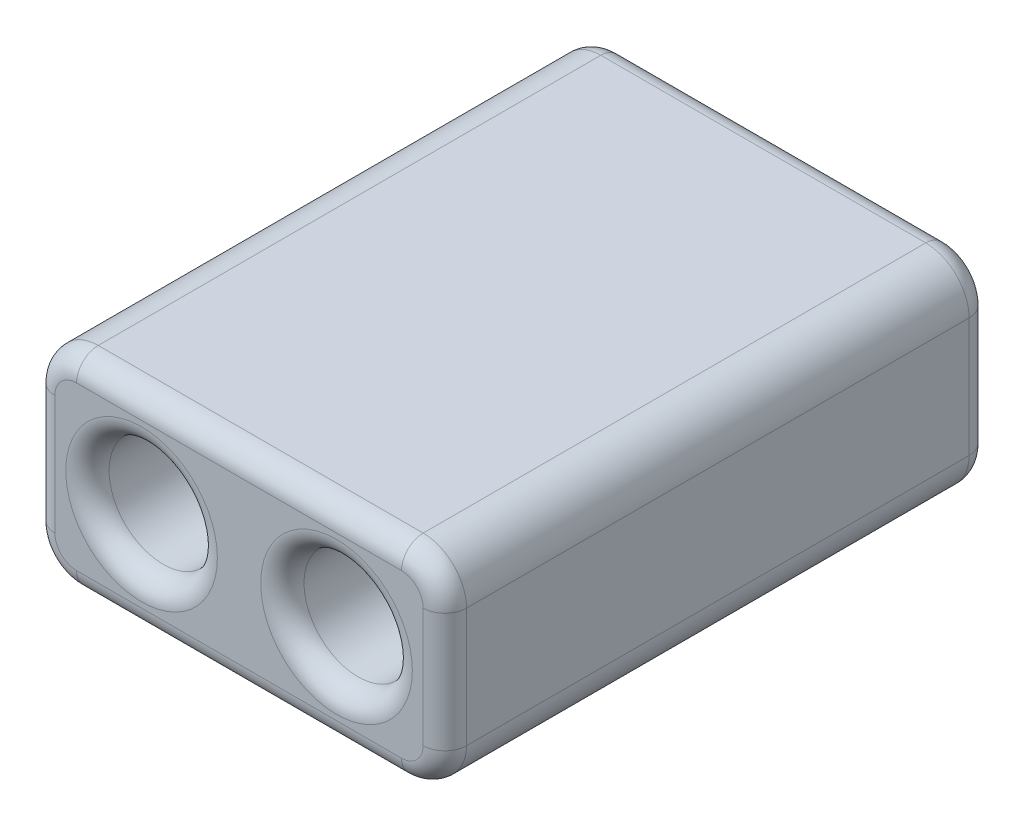
ISO-10303-21;
HEADER;
FILE_DESCRIPTION(('STEP AP214'),'2;1');
FILE_NAME('part.step','',(''),(''),'','','');
FILE_SCHEMA(('AUTOMOTIVE_DESIGN { 1 0 10303 214 1 1 1 1 }'));
ENDSEC;
DATA;
#1=APPLICATION_CONTEXT('core data for automotive mechanical design processes');
#2=APPLICATION_PROTOCOL_DEFINITION('international standard','automotive_design',2000,#1);
#3=PRODUCT_CONTEXT('',#1,'mechanical');
#4=PRODUCT('Part','Part','',(#3));
#5=PRODUCT_RELATED_PRODUCT_CATEGORY('part','',(#4));
#6=PRODUCT_DEFINITION_FORMATION('','',#4);
#7=PRODUCT_DEFINITION_CONTEXT('part definition',#1,'design');
#8=PRODUCT_DEFINITION('design','',#6,#7);
#9=PRODUCT_DEFINITION_SHAPE('','',#8);
#10=(LENGTH_UNIT() NAMED_UNIT(*) SI_UNIT(.MILLI.,.METRE.));
#11=(NAMED_UNIT(*) PLANE_ANGLE_UNIT() SI_UNIT($,.RADIAN.));
#12=(NAMED_UNIT(*) SI_UNIT($,.STERADIAN.) SOLID_ANGLE_UNIT());
#13=UNCERTAINTY_MEASURE_WITH_UNIT(LENGTH_MEASURE(1.E-05),#10,'distance_accuracy_value','');
#14=(GEOMETRIC_REPRESENTATION_CONTEXT(3) GLOBAL_UNCERTAINTY_ASSIGNED_CONTEXT((#13)) GLOBAL_UNIT_ASSIGNED_CONTEXT((#10,
#11,#12)) REPRESENTATION_CONTEXT('',''));
#15=CARTESIAN_POINT('',(0.,0.,0.));
#16=DIRECTION('',(0.,0.,1.));
#17=DIRECTION('',(1.,0.,0.));
#18=AXIS2_PLACEMENT_3D('',#15,#16,#17);
#19=CARTESIAN_POINT('',(0.,0.,25.2));
#20=DIRECTION('',(0.,0.,1.));
#21=DIRECTION('',(1.,0.,0.));
#22=AXIS2_PLACEMENT_3D('',#19,#20,#21);
#23=PLANE('',#22);
#24=CARTESIAN_POINT('',(4.5,0.,25.2));
#25=DIRECTION('',(0.,0.,1.));
#26=DIRECTION('',(1.,0.,0.));
#27=AXIS2_PLACEMENT_3D('',#24,#25,#26);
#28=CIRCLE('',#27,3.5);
#29=CARTESIAN_POINT('',(8.,0.,25.2));
#30=VERTEX_POINT('',#29);
#31=EDGE_CURVE('E179',#30,#30,#28,.F.);
#32=ORIENTED_EDGE('',*,*,#31,.T.);
#33=EDGE_LOOP('',(#32));
#34=FACE_BOUND('',#33,.T.);
#35=DIRECTION('',(0.,-1.,0.));
#36=VECTOR('',#35,1.);
#37=CARTESIAN_POINT('',(-8.5,-2.75,25.2));
#38=LINE('',#37,#36);
#39=CARTESIAN_POINT('',(-8.5,2.75,25.2));
#40=VERTEX_POINT('',#39);
#41=CARTESIAN_POINT('',(-8.5,-2.75,25.2));
#42=VERTEX_POINT('',#41);
#43=EDGE_CURVE('E177',#40,#42,#38,.T.);
#44=ORIENTED_EDGE('',*,*,#43,.T.);
#45=CARTESIAN_POINT('',(-7.5,-2.75,25.2));
#46=DIRECTION('',(0.,0.,1.));
#47=DIRECTION('',(1.,0.,0.));
#48=AXIS2_PLACEMENT_3D('',#45,#46,#47);
#49=CIRCLE('',#48,1.);
#50=CARTESIAN_POINT('',(-7.5,-3.75,25.2));
#51=VERTEX_POINT('',#50);
#52=EDGE_CURVE('E158',#42,#51,#49,.T.);
#53=ORIENTED_EDGE('',*,*,#52,.T.);
#54=DIRECTION('',(1.,0.,0.));
#55=VECTOR('',#54,1.);
#56=CARTESIAN_POINT('',(7.5,-3.75,25.2));
#57=LINE('',#56,#55);
#58=CARTESIAN_POINT('',(7.5,-3.75,25.2));
#59=VERTEX_POINT('',#58);
#60=EDGE_CURVE('E166',#51,#59,#57,.T.);
#61=ORIENTED_EDGE('',*,*,#60,.T.);
#62=CARTESIAN_POINT('',(7.5,-2.75,25.2));
#63=DIRECTION('',(0.,0.,1.));
#64=DIRECTION('',(1.,0.,0.));
#65=AXIS2_PLACEMENT_3D('',#62,#63,#64);
#66=CIRCLE('',#65,1.);
#67=CARTESIAN_POINT('',(8.49999999999999,-2.75,25.2));
#68=VERTEX_POINT('',#67);
#69=EDGE_CURVE('E172',#59,#68,#66,.T.);
#70=ORIENTED_EDGE('',*,*,#69,.T.);
#71=DIRECTION('',(0.,1.,0.));
#72=VECTOR('',#71,1.);
#73=CARTESIAN_POINT('',(8.5,2.75,25.2));
#74=LINE('',#73,#72);
#75=CARTESIAN_POINT('',(8.5,2.75,25.2));
#76=VERTEX_POINT('',#75);
#77=EDGE_CURVE('E327',#68,#76,#74,.T.);
#78=ORIENTED_EDGE('',*,*,#77,.T.);
#79=CARTESIAN_POINT('',(7.5,2.75,25.2));
#80=DIRECTION('',(0.,0.,1.));
#81=DIRECTION('',(1.,0.,0.));
#82=AXIS2_PLACEMENT_3D('',#79,#80,#81);
#83=CIRCLE('',#82,1.);
#84=CARTESIAN_POINT('',(7.5,3.75,25.2));
#85=VERTEX_POINT('',#84);
#86=EDGE_CURVE('E329',#76,#85,#83,.T.);
#87=ORIENTED_EDGE('',*,*,#86,.T.);
#88=DIRECTION('',(-1.,0.,0.));
#89=VECTOR('',#88,1.);
#90=CARTESIAN_POINT('',(-7.5,3.75,25.2));
#91=LINE('',#90,#89);
#92=CARTESIAN_POINT('',(-7.5,3.75,25.2));
#93=VERTEX_POINT('',#92);
#94=EDGE_CURVE('E331',#85,#93,#91,.T.);
#95=ORIENTED_EDGE('',*,*,#94,.T.);
#96=CARTESIAN_POINT('',(-7.5,2.75,25.2));
#97=DIRECTION('',(0.,0.,1.));
#98=DIRECTION('',(1.,0.,0.));
#99=AXIS2_PLACEMENT_3D('',#96,#97,#98);
#100=CIRCLE('',#99,1.);
#101=EDGE_CURVE('E183',#93,#40,#100,.T.);
#102=ORIENTED_EDGE('',*,*,#101,.T.);
#103=EDGE_LOOP('',(#44,#53,#61,#70,#78,#87,#95,#102));
#104=FACE_BOUND('',#103,.T.);
#105=CARTESIAN_POINT('',(-4.5,0.,25.2));
#106=DIRECTION('',(0.,0.,1.));
#107=DIRECTION('',(1.,0.,0.));
#108=AXIS2_PLACEMENT_3D('',#105,#106,#107);
#109=CIRCLE('',#108,3.5);
#110=CARTESIAN_POINT('',(-1.,0.,25.2));
#111=VERTEX_POINT('',#110);
#112=EDGE_CURVE('E173',#111,#111,#109,.F.);
#113=ORIENTED_EDGE('',*,*,#112,.T.);
#114=EDGE_LOOP('',(#113));
#115=FACE_BOUND('',#114,.T.);
#116=ADVANCED_FACE('F37',(#34,#104,#115),#23,.T.);
#117=CARTESIAN_POINT('',(0.,0.,0.));
#118=DIRECTION('',(0.,0.,1.));
#119=DIRECTION('',(1.,0.,0.));
#120=AXIS2_PLACEMENT_3D('',#117,#118,#119);
#121=PLANE('',#120);
#122=CARTESIAN_POINT('',(4.5,0.,0.));
#123=DIRECTION('',(0.,0.,1.));
#124=DIRECTION('',(1.,0.,0.));
#125=AXIS2_PLACEMENT_3D('',#122,#123,#124);
#126=CIRCLE('',#125,3.5);
#127=CARTESIAN_POINT('',(8.,0.,0.));
#128=VERTEX_POINT('',#127);
#129=EDGE_CURVE('E246',#128,#128,#126,.T.);
#130=ORIENTED_EDGE('',*,*,#129,.T.);
#131=EDGE_LOOP('',(#130));
#132=FACE_BOUND('',#131,.T.);
#133=CARTESIAN_POINT('',(-4.5,0.,0.));
#134=DIRECTION('',(0.,0.,1.));
#135=DIRECTION('',(1.,0.,0.));
#136=AXIS2_PLACEMENT_3D('',#133,#134,#135);
#137=CIRCLE('',#136,3.5);
#138=CARTESIAN_POINT('',(-1.,0.,0.));
#139=VERTEX_POINT('',#138);
#140=EDGE_CURVE('E243',#139,#139,#137,.T.);
#141=ORIENTED_EDGE('',*,*,#140,.T.);
#142=EDGE_LOOP('',(#141));
#143=FACE_BOUND('',#142,.T.);
#144=DIRECTION('',(-1.,0.,0.));
#145=VECTOR('',#144,1.);
#146=CARTESIAN_POINT('',(0.,3.75,0.));
#147=LINE('',#146,#145);
#148=CARTESIAN_POINT('',(-7.5,3.75,0.));
#149=VERTEX_POINT('',#148);
#150=CARTESIAN_POINT('',(7.5,3.75,0.));
#151=VERTEX_POINT('',#150);
#152=EDGE_CURVE('E238',#149,#151,#147,.F.);
#153=ORIENTED_EDGE('',*,*,#152,.T.);
#154=CARTESIAN_POINT('',(7.5,2.75,0.));
#155=DIRECTION('',(0.,0.,1.));
#156=DIRECTION('',(1.,0.,0.));
#157=AXIS2_PLACEMENT_3D('',#154,#155,#156);
#158=CIRCLE('',#157,1.);
#159=CARTESIAN_POINT('',(8.5,2.75,0.));
#160=VERTEX_POINT('',#159);
#161=EDGE_CURVE('E240',#151,#160,#158,.F.);
#162=ORIENTED_EDGE('',*,*,#161,.T.);
#163=DIRECTION('',(0.,1.,0.));
#164=VECTOR('',#163,1.);
#165=CARTESIAN_POINT('',(8.49999999999999,0.,0.));
#166=LINE('',#165,#164);
#167=CARTESIAN_POINT('',(8.49999999999999,-2.75,0.));
#168=VERTEX_POINT('',#167);
#169=EDGE_CURVE('E207',#160,#168,#166,.F.);
#170=ORIENTED_EDGE('',*,*,#169,.T.);
#171=CARTESIAN_POINT('',(7.5,-2.75,0.));
#172=DIRECTION('',(0.,0.,1.));
#173=DIRECTION('',(1.,0.,0.));
#174=AXIS2_PLACEMENT_3D('',#171,#172,#173);
#175=CIRCLE('',#174,1.);
#176=CARTESIAN_POINT('',(7.5,-3.75,0.));
#177=VERTEX_POINT('',#176);
#178=EDGE_CURVE('E228',#168,#177,#175,.F.);
#179=ORIENTED_EDGE('',*,*,#178,.T.);
#180=DIRECTION('',(1.,0.,0.));
#181=VECTOR('',#180,1.);
#182=CARTESIAN_POINT('',(0.,-3.75,0.));
#183=LINE('',#182,#181);
#184=CARTESIAN_POINT('',(-7.5,-3.75,0.));
#185=VERTEX_POINT('',#184);
#186=EDGE_CURVE('E230',#177,#185,#183,.F.);
#187=ORIENTED_EDGE('',*,*,#186,.T.);
#188=CARTESIAN_POINT('',(-7.5,-2.75,0.));
#189=DIRECTION('',(0.,0.,1.));
#190=DIRECTION('',(1.,0.,0.));
#191=AXIS2_PLACEMENT_3D('',#188,#189,#190);
#192=CIRCLE('',#191,1.);
#193=CARTESIAN_POINT('',(-8.5,-2.75,0.));
#194=VERTEX_POINT('',#193);
#195=EDGE_CURVE('E232',#185,#194,#192,.F.);
#196=ORIENTED_EDGE('',*,*,#195,.T.);
#197=DIRECTION('',(0.,-1.,0.));
#198=VECTOR('',#197,1.);
#199=CARTESIAN_POINT('',(-8.5,0.,0.));
#200=LINE('',#199,#198);
#201=CARTESIAN_POINT('',(-8.5,2.75,0.));
#202=VERTEX_POINT('',#201);
#203=EDGE_CURVE('E234',#194,#202,#200,.F.);
#204=ORIENTED_EDGE('',*,*,#203,.T.);
#205=CARTESIAN_POINT('',(-7.5,2.75,0.));
#206=DIRECTION('',(0.,0.,1.));
#207=DIRECTION('',(1.,0.,0.));
#208=AXIS2_PLACEMENT_3D('',#205,#206,#207);
#209=CIRCLE('',#208,1.);
#210=EDGE_CURVE('E236',#202,#149,#209,.F.);
#211=ORIENTED_EDGE('',*,*,#210,.T.);
#212=EDGE_LOOP('',(#153,#162,#170,#179,#187,#196,#204,#211));
#213=FACE_BOUND('',#212,.T.);
#214=ADVANCED_FACE('F361',(#132,#143,#213),#121,.F.);
#215=CARTESIAN_POINT('',(9.5,4.75,25.2));
#216=DIRECTION('',(-1.,0.,0.));
#217=DIRECTION('',(0.,-1.,0.));
#218=AXIS2_PLACEMENT_3D('',#215,#216,#217);
#219=PLANE('',#218);
#220=DIRECTION('',(0.,0.,-1.));
#221=VECTOR('',#220,1.);
#222=CARTESIAN_POINT('',(9.5,-2.75,25.2));
#223=LINE('',#222,#221);
#224=CARTESIAN_POINT('',(9.5,-2.75,24.2));
#225=VERTEX_POINT('',#224);
#226=CARTESIAN_POINT('',(9.5,-2.75,1.));
#227=VERTEX_POINT('',#226);
#228=EDGE_CURVE('E306',#225,#227,#223,.T.);
#229=ORIENTED_EDGE('',*,*,#228,.T.);
#230=DIRECTION('',(0.,1.,0.));
#231=VECTOR('',#230,1.);
#232=CARTESIAN_POINT('',(9.5,4.75,1.));
#233=LINE('',#232,#231);
#234=CARTESIAN_POINT('',(9.5,2.75,1.));
#235=VERTEX_POINT('',#234);
#236=EDGE_CURVE('E11',#227,#235,#233,.T.);
#237=ORIENTED_EDGE('',*,*,#236,.T.);
#238=DIRECTION('',(0.,0.,-1.));
#239=VECTOR('',#238,1.);
#240=CARTESIAN_POINT('',(9.5,2.75,25.2));
#241=LINE('',#240,#239);
#242=CARTESIAN_POINT('',(9.5,2.75,24.2));
#243=VERTEX_POINT('',#242);
#244=EDGE_CURVE('E226',#235,#243,#241,.F.);
#245=ORIENTED_EDGE('',*,*,#244,.T.);
#246=DIRECTION('',(0.,1.,0.));
#247=VECTOR('',#246,1.);
#248=CARTESIAN_POINT('',(9.5,-2.75,24.2));
#249=LINE('',#248,#247);
#250=EDGE_CURVE('E198',#243,#225,#249,.F.);
#251=ORIENTED_EDGE('',*,*,#250,.T.);
#252=EDGE_LOOP('',(#229,#237,#245,#251));
#253=FACE_BOUND('',#252,.T.);
#254=ADVANCED_FACE('F375',(#253),#219,.F.);
#255=CARTESIAN_POINT('',(-9.5,4.75,25.2));
#256=DIRECTION('',(0.,-1.,0.));
#257=DIRECTION('',(0.,0.,-1.));
#258=AXIS2_PLACEMENT_3D('',#255,#256,#257);
#259=PLANE('',#258);
#260=DIRECTION('',(0.,0.,-1.));
#261=VECTOR('',#260,1.);
#262=CARTESIAN_POINT('',(7.5,4.75,25.2));
#263=LINE('',#262,#261);
#264=CARTESIAN_POINT('',(7.5,4.75,24.2));
#265=VERTEX_POINT('',#264);
#266=CARTESIAN_POINT('',(7.5,4.75,1.));
#267=VERTEX_POINT('',#266);
#268=EDGE_CURVE('E314',#265,#267,#263,.T.);
#269=ORIENTED_EDGE('',*,*,#268,.T.);
#270=DIRECTION('',(-1.,0.,0.));
#271=VECTOR('',#270,1.);
#272=CARTESIAN_POINT('',(-9.5,4.75,1.));
#273=LINE('',#272,#271);
#274=CARTESIAN_POINT('',(-7.5,4.75,1.));
#275=VERTEX_POINT('',#274);
#276=EDGE_CURVE('E258',#267,#275,#273,.T.);
#277=ORIENTED_EDGE('',*,*,#276,.T.);
#278=DIRECTION('',(0.,0.,-1.));
#279=VECTOR('',#278,1.);
#280=CARTESIAN_POINT('',(-7.5,4.75,25.2));
#281=LINE('',#280,#279);
#282=CARTESIAN_POINT('',(-7.5,4.75,24.2));
#283=VERTEX_POINT('',#282);
#284=EDGE_CURVE('E308',#275,#283,#281,.F.);
#285=ORIENTED_EDGE('',*,*,#284,.T.);
#286=DIRECTION('',(-1.,0.,0.));
#287=VECTOR('',#286,1.);
#288=CARTESIAN_POINT('',(7.5,4.75,24.2));
#289=LINE('',#288,#287);
#290=EDGE_CURVE('E193',#283,#265,#289,.F.);
#291=ORIENTED_EDGE('',*,*,#290,.T.);
#292=EDGE_LOOP('',(#269,#277,#285,#291));
#293=FACE_BOUND('',#292,.T.);
#294=ADVANCED_FACE('F407',(#293),#259,.F.);
#295=CARTESIAN_POINT('',(-9.5,4.75,25.2));
#296=DIRECTION('',(1.,0.,0.));
#297=DIRECTION('',(0.,0.,-1.));
#298=AXIS2_PLACEMENT_3D('',#295,#296,#297);
#299=PLANE('',#298);
#300=DIRECTION('',(0.,0.,-1.));
#301=VECTOR('',#300,1.);
#302=CARTESIAN_POINT('',(-9.5,2.75,25.2));
#303=LINE('',#302,#301);
#304=CARTESIAN_POINT('',(-9.5,2.75,24.2));
#305=VERTEX_POINT('',#304);
#306=CARTESIAN_POINT('',(-9.5,2.75,1.));
#307=VERTEX_POINT('',#306);
#308=EDGE_CURVE('E317',#305,#307,#303,.T.);
#309=ORIENTED_EDGE('',*,*,#308,.T.);
#310=DIRECTION('',(0.,-1.,0.));
#311=VECTOR('',#310,1.);
#312=CARTESIAN_POINT('',(-9.5,4.75,1.));
#313=LINE('',#312,#311);
#314=CARTESIAN_POINT('',(-9.5,-2.75,1.));
#315=VERTEX_POINT('',#314);
#316=EDGE_CURVE('E262',#307,#315,#313,.T.);
#317=ORIENTED_EDGE('',*,*,#316,.T.);
#318=DIRECTION('',(0.,0.,-1.));
#319=VECTOR('',#318,1.);
#320=CARTESIAN_POINT('',(-9.5,-2.75,25.2));
#321=LINE('',#320,#319);
#322=CARTESIAN_POINT('',(-9.5,-2.75,24.2));
#323=VERTEX_POINT('',#322);
#324=EDGE_CURVE('E303',#315,#323,#321,.F.);
#325=ORIENTED_EDGE('',*,*,#324,.T.);
#326=DIRECTION('',(0.,-1.,0.));
#327=VECTOR('',#326,1.);
#328=CARTESIAN_POINT('',(-9.5,2.75,24.2));
#329=LINE('',#328,#327);
#330=EDGE_CURVE('E188',#323,#305,#329,.F.);
#331=ORIENTED_EDGE('',*,*,#330,.T.);
#332=EDGE_LOOP('',(#309,#317,#325,#331));
#333=FACE_BOUND('',#332,.T.);
#334=ADVANCED_FACE('F344',(#333),#299,.F.);
#335=CARTESIAN_POINT('',(-9.5,-4.75,25.2));
#336=DIRECTION('',(0.,1.,0.));
#337=DIRECTION('',(0.,0.,1.));
#338=AXIS2_PLACEMENT_3D('',#335,#336,#337);
#339=PLANE('',#338);
#340=DIRECTION('',(0.,0.,-1.));
#341=VECTOR('',#340,1.);
#342=CARTESIAN_POINT('',(-7.5,-4.75,25.2));
#343=LINE('',#342,#341);
#344=CARTESIAN_POINT('',(-7.5,-4.75,24.2));
#345=VERTEX_POINT('',#344);
#346=CARTESIAN_POINT('',(-7.5,-4.75,1.));
#347=VERTEX_POINT('',#346);
#348=EDGE_CURVE('E302',#345,#347,#343,.T.);
#349=ORIENTED_EDGE('',*,*,#348,.T.);
#350=DIRECTION('',(1.,0.,0.));
#351=VECTOR('',#350,1.);
#352=CARTESIAN_POINT('',(-9.5,-4.75,1.));
#353=LINE('',#352,#351);
#354=CARTESIAN_POINT('',(7.5,-4.75,1.));
#355=VERTEX_POINT('',#354);
#356=EDGE_CURVE('E61',#347,#355,#353,.T.);
#357=ORIENTED_EDGE('',*,*,#356,.T.);
#358=DIRECTION('',(0.,0.,-1.));
#359=VECTOR('',#358,1.);
#360=CARTESIAN_POINT('',(7.5,-4.75,25.2));
#361=LINE('',#360,#359);
#362=CARTESIAN_POINT('',(7.5,-4.75,24.2));
#363=VERTEX_POINT('',#362);
#364=EDGE_CURVE('E305',#355,#363,#361,.F.);
#365=ORIENTED_EDGE('',*,*,#364,.T.);
#366=DIRECTION('',(1.,0.,0.));
#367=VECTOR('',#366,1.);
#368=CARTESIAN_POINT('',(-7.5,-4.75,24.2));
#369=LINE('',#368,#367);
#370=EDGE_CURVE('E203',#363,#345,#369,.F.);
#371=ORIENTED_EDGE('',*,*,#370,.T.);
#372=EDGE_LOOP('',(#349,#357,#365,#371));
#373=FACE_BOUND('',#372,.T.);
#374=ADVANCED_FACE('F304',(#373),#339,.F.);
#375=CARTESIAN_POINT('',(-4.5,0.,25.2));
#376=DIRECTION('',(0.,0.,-1.));
#377=DIRECTION('',(-1.,0.,0.));
#378=AXIS2_PLACEMENT_3D('',#375,#376,#377);
#379=CYLINDRICAL_SURFACE('',#378,2.5);
#380=CARTESIAN_POINT('',(-4.5,0.,1.));
#381=DIRECTION('',(0.,0.,1.));
#382=DIRECTION('',(1.,0.,0.));
#383=AXIS2_PLACEMENT_3D('',#380,#381,#382);
#384=CIRCLE('',#383,2.5);
#385=CARTESIAN_POINT('',(-2.,0.,1.));
#386=VERTEX_POINT('',#385);
#387=EDGE_CURVE('E252',#386,#386,#384,.F.);
#388=ORIENTED_EDGE('',*,*,#387,.T.);
#389=EDGE_LOOP('',(#388));
#390=FACE_BOUND('',#389,.T.);
#391=CARTESIAN_POINT('',(-4.5,0.,24.2));
#392=DIRECTION('',(0.,0.,1.));
#393=DIRECTION('',(1.,0.,0.));
#394=AXIS2_PLACEMENT_3D('',#391,#392,#393);
#395=CIRCLE('',#394,2.5);
#396=CARTESIAN_POINT('',(-2.,0.,24.2));
#397=VERTEX_POINT('',#396);
#398=EDGE_CURVE('E205',#397,#397,#395,.T.);
#399=ORIENTED_EDGE('',*,*,#398,.T.);
#400=EDGE_LOOP('',(#399));
#401=FACE_BOUND('',#400,.T.);
#402=ADVANCED_FACE('F400',(#390,#401),#379,.F.);
#403=CARTESIAN_POINT('',(4.5,0.,25.2));
#404=DIRECTION('',(0.,0.,-1.));
#405=DIRECTION('',(-1.,0.,0.));
#406=AXIS2_PLACEMENT_3D('',#403,#404,#405);
#407=CYLINDRICAL_SURFACE('',#406,2.5);
#408=CARTESIAN_POINT('',(4.5,0.,1.));
#409=DIRECTION('',(0.,0.,1.));
#410=DIRECTION('',(1.,0.,0.));
#411=AXIS2_PLACEMENT_3D('',#408,#409,#410);
#412=CIRCLE('',#411,2.5);
#413=CARTESIAN_POINT('',(7.,0.,1.));
#414=VERTEX_POINT('',#413);
#415=EDGE_CURVE('E249',#414,#414,#412,.F.);
#416=ORIENTED_EDGE('',*,*,#415,.T.);
#417=EDGE_LOOP('',(#416));
#418=FACE_BOUND('',#417,.T.);
#419=CARTESIAN_POINT('',(4.5,0.,24.2));
#420=DIRECTION('',(0.,0.,1.));
#421=DIRECTION('',(1.,0.,0.));
#422=AXIS2_PLACEMENT_3D('',#419,#420,#421);
#423=CIRCLE('',#422,2.5);
#424=CARTESIAN_POINT('',(7.,0.,24.2));
#425=VERTEX_POINT('',#424);
#426=EDGE_CURVE('E321',#425,#425,#423,.T.);
#427=ORIENTED_EDGE('',*,*,#426,.T.);
#428=EDGE_LOOP('',(#427));
#429=FACE_BOUND('',#428,.T.);
#430=ADVANCED_FACE('F416',(#418,#429),#407,.F.);
#431=CARTESIAN_POINT('',(7.5,-2.75,25.2));
#432=DIRECTION('',(0.,0.,-1.));
#433=DIRECTION('',(-1.,0.,0.));
#434=AXIS2_PLACEMENT_3D('',#431,#432,#433);
#435=CYLINDRICAL_SURFACE('',#434,2.);
#436=ORIENTED_EDGE('',*,*,#364,.F.);
#437=CARTESIAN_POINT('',(7.5,-2.75,1.));
#438=DIRECTION('',(0.,0.,1.));
#439=DIRECTION('',(1.,0.,0.));
#440=AXIS2_PLACEMENT_3D('',#437,#438,#439);
#441=CIRCLE('',#440,2.);
#442=EDGE_CURVE('E46',#355,#227,#441,.T.);
#443=ORIENTED_EDGE('',*,*,#442,.T.);
#444=ORIENTED_EDGE('',*,*,#228,.F.);
#445=CARTESIAN_POINT('',(7.5,-2.75,24.2));
#446=DIRECTION('',(0.,0.,1.));
#447=DIRECTION('',(1.,0.,0.));
#448=AXIS2_PLACEMENT_3D('',#445,#446,#447);
#449=CIRCLE('',#448,2.);
#450=EDGE_CURVE('E200',#225,#363,#449,.F.);
#451=ORIENTED_EDGE('',*,*,#450,.T.);
#452=EDGE_LOOP('',(#436,#443,#444,#451));
#453=FACE_BOUND('',#452,.T.);
#454=ADVANCED_FACE('F413',(#453),#435,.T.);
#455=CARTESIAN_POINT('',(7.5,2.75,25.2));
#456=DIRECTION('',(0.,0.,-1.));
#457=DIRECTION('',(-1.,0.,0.));
#458=AXIS2_PLACEMENT_3D('',#455,#456,#457);
#459=CYLINDRICAL_SURFACE('',#458,2.);
#460=ORIENTED_EDGE('',*,*,#244,.F.);
#461=CARTESIAN_POINT('',(7.5,2.75,1.));
#462=DIRECTION('',(0.,0.,1.));
#463=DIRECTION('',(1.,0.,0.));
#464=AXIS2_PLACEMENT_3D('',#461,#462,#463);
#465=CIRCLE('',#464,2.);
#466=EDGE_CURVE('E255',#235,#267,#465,.T.);
#467=ORIENTED_EDGE('',*,*,#466,.T.);
#468=ORIENTED_EDGE('',*,*,#268,.F.);
#469=CARTESIAN_POINT('',(7.5,2.75,24.2));
#470=DIRECTION('',(0.,0.,1.));
#471=DIRECTION('',(1.,0.,0.));
#472=AXIS2_PLACEMENT_3D('',#469,#470,#471);
#473=CIRCLE('',#472,2.);
#474=EDGE_CURVE('E195',#265,#243,#473,.F.);
#475=ORIENTED_EDGE('',*,*,#474,.T.);
#476=EDGE_LOOP('',(#460,#467,#468,#475));
#477=FACE_BOUND('',#476,.T.);
#478=ADVANCED_FACE('F378',(#477),#459,.T.);
#479=CARTESIAN_POINT('',(-7.5,-2.75,25.2));
#480=DIRECTION('',(0.,0.,-1.));
#481=DIRECTION('',(-1.,0.,0.));
#482=AXIS2_PLACEMENT_3D('',#479,#480,#481);
#483=CYLINDRICAL_SURFACE('',#482,2.);
#484=ORIENTED_EDGE('',*,*,#324,.F.);
#485=CARTESIAN_POINT('',(-7.5,-2.75,1.));
#486=DIRECTION('',(0.,0.,1.));
#487=DIRECTION('',(1.,0.,0.));
#488=AXIS2_PLACEMENT_3D('',#485,#486,#487);
#489=CIRCLE('',#488,2.);
#490=EDGE_CURVE('E264',#315,#347,#489,.T.);
#491=ORIENTED_EDGE('',*,*,#490,.T.);
#492=ORIENTED_EDGE('',*,*,#348,.F.);
#493=CARTESIAN_POINT('',(-7.5,-2.75,24.2));
#494=DIRECTION('',(0.,0.,1.));
#495=DIRECTION('',(1.,0.,0.));
#496=AXIS2_PLACEMENT_3D('',#493,#494,#495);
#497=CIRCLE('',#496,2.);
#498=EDGE_CURVE('E160',#345,#323,#497,.F.);
#499=ORIENTED_EDGE('',*,*,#498,.T.);
#500=EDGE_LOOP('',(#484,#491,#492,#499));
#501=FACE_BOUND('',#500,.T.);
#502=ADVANCED_FACE('F301',(#501),#483,.T.);
#503=CARTESIAN_POINT('',(-7.5,2.75,25.2));
#504=DIRECTION('',(0.,0.,-1.));
#505=DIRECTION('',(-1.,0.,0.));
#506=AXIS2_PLACEMENT_3D('',#503,#504,#505);
#507=CYLINDRICAL_SURFACE('',#506,2.);
#508=ORIENTED_EDGE('',*,*,#284,.F.);
#509=CARTESIAN_POINT('',(-7.5,2.75,1.));
#510=DIRECTION('',(0.,0.,1.));
#511=DIRECTION('',(1.,0.,0.));
#512=AXIS2_PLACEMENT_3D('',#509,#510,#511);
#513=CIRCLE('',#512,2.);
#514=EDGE_CURVE('E260',#275,#307,#513,.T.);
#515=ORIENTED_EDGE('',*,*,#514,.T.);
#516=ORIENTED_EDGE('',*,*,#308,.F.);
#517=CARTESIAN_POINT('',(-7.5,2.75,24.2));
#518=DIRECTION('',(0.,0.,1.));
#519=DIRECTION('',(1.,0.,0.));
#520=AXIS2_PLACEMENT_3D('',#517,#518,#519);
#521=CIRCLE('',#520,2.);
#522=EDGE_CURVE('E190',#305,#283,#521,.F.);
#523=ORIENTED_EDGE('',*,*,#522,.T.);
#524=EDGE_LOOP('',(#508,#515,#516,#523));
#525=FACE_BOUND('',#524,.T.);
#526=ADVANCED_FACE('F347',(#525),#507,.T.);
#527=CARTESIAN_POINT('',(4.5,0.,24.2));
#528=DIRECTION('',(0.,0.,1.));
#529=DIRECTION('',(1.,0.,0.));
#530=AXIS2_PLACEMENT_3D('',#527,#528,#529);
#531=TOROIDAL_SURFACE('',#530,3.5,1.);
#532=ORIENTED_EDGE('',*,*,#31,.F.);
#533=EDGE_LOOP('',(#532));
#534=FACE_BOUND('',#533,.T.);
#535=ORIENTED_EDGE('',*,*,#426,.F.);
#536=EDGE_LOOP('',(#535));
#537=FACE_BOUND('',#536,.T.);
#538=ADVANCED_FACE('F423',(#534,#537),#531,.T.);
#539=CARTESIAN_POINT('',(7.5,2.75,24.2));
#540=DIRECTION('',(0.,0.,1.));
#541=DIRECTION('',(1.,0.,0.));
#542=AXIS2_PLACEMENT_3D('',#539,#540,#541);
#543=DEGENERATE_TOROIDAL_SURFACE('',#542,1.,1.,.T.);
#544=CARTESIAN_POINT('',(8.5,2.75,24.2));
#545=DIRECTION('',(0.,-1.,0.));
#546=DIRECTION('',(1.,0.,0.));
#547=AXIS2_PLACEMENT_3D('',#544,#545,#546);
#548=CIRCLE('',#547,1.);
#549=EDGE_CURVE('E220',#243,#76,#548,.T.);
#550=ORIENTED_EDGE('',*,*,#549,.F.);
#551=ORIENTED_EDGE('',*,*,#474,.F.);
#552=CARTESIAN_POINT('',(7.5,3.75,24.2));
#553=DIRECTION('',(-1.,0.,0.));
#554=DIRECTION('',(0.,0.,1.));
#555=AXIS2_PLACEMENT_3D('',#552,#553,#554);
#556=CIRCLE('',#555,1.);
#557=EDGE_CURVE('E223',#85,#265,#556,.T.);
#558=ORIENTED_EDGE('',*,*,#557,.F.);
#559=ORIENTED_EDGE('',*,*,#86,.F.);
#560=EDGE_LOOP('',(#550,#551,#558,#559));
#561=FACE_BOUND('',#560,.T.);
#562=ADVANCED_FACE('F426',(#561),#543,.T.);
#563=CARTESIAN_POINT('',(0.,3.75,24.2));
#564=DIRECTION('',(1.,0.,0.));
#565=DIRECTION('',(0.,0.,-1.));
#566=AXIS2_PLACEMENT_3D('',#563,#564,#565);
#567=CYLINDRICAL_SURFACE('',#566,1.);
#568=ORIENTED_EDGE('',*,*,#557,.T.);
#569=ORIENTED_EDGE('',*,*,#290,.F.);
#570=CARTESIAN_POINT('',(-7.5,3.75,24.2));
#571=DIRECTION('',(-1.,0.,0.));
#572=DIRECTION('',(0.,0.,1.));
#573=AXIS2_PLACEMENT_3D('',#570,#571,#572);
#574=CIRCLE('',#573,1.);
#575=EDGE_CURVE('E217',#93,#283,#574,.T.);
#576=ORIENTED_EDGE('',*,*,#575,.F.);
#577=ORIENTED_EDGE('',*,*,#94,.F.);
#578=EDGE_LOOP('',(#568,#569,#576,#577));
#579=FACE_BOUND('',#578,.T.);
#580=ADVANCED_FACE('F444',(#579),#567,.T.);
#581=CARTESIAN_POINT('',(8.5,0.,24.2));
#582=DIRECTION('',(0.,-1.,0.));
#583=DIRECTION('',(1.,0.,0.));
#584=AXIS2_PLACEMENT_3D('',#581,#582,#583);
#585=CYLINDRICAL_SURFACE('',#584,1.);
#586=ORIENTED_EDGE('',*,*,#549,.T.);
#587=ORIENTED_EDGE('',*,*,#77,.F.);
#588=CARTESIAN_POINT('',(8.5,-2.75,24.2));
#589=DIRECTION('',(0.,-1.,0.));
#590=DIRECTION('',(0.,0.,-1.));
#591=AXIS2_PLACEMENT_3D('',#588,#589,#590);
#592=CIRCLE('',#591,1.);
#593=EDGE_CURVE('E214',#225,#68,#592,.T.);
#594=ORIENTED_EDGE('',*,*,#593,.F.);
#595=ORIENTED_EDGE('',*,*,#250,.F.);
#596=EDGE_LOOP('',(#586,#587,#594,#595));
#597=FACE_BOUND('',#596,.T.);
#598=ADVANCED_FACE('F441',(#597),#585,.T.);
#599=CARTESIAN_POINT('',(-7.5,2.75,24.2));
#600=DIRECTION('',(0.,0.,1.));
#601=DIRECTION('',(1.,0.,0.));
#602=AXIS2_PLACEMENT_3D('',#599,#600,#601);
#603=DEGENERATE_TOROIDAL_SURFACE('',#602,1.,1.,.T.);
#604=ORIENTED_EDGE('',*,*,#575,.T.);
#605=ORIENTED_EDGE('',*,*,#522,.F.);
#606=CARTESIAN_POINT('',(-8.5,2.75,24.2));
#607=DIRECTION('',(0.,-1.,0.));
#608=DIRECTION('',(0.,0.,-1.));
#609=AXIS2_PLACEMENT_3D('',#606,#607,#608);
#610=CIRCLE('',#609,1.);
#611=EDGE_CURVE('E211',#40,#305,#610,.T.);
#612=ORIENTED_EDGE('',*,*,#611,.F.);
#613=ORIENTED_EDGE('',*,*,#101,.F.);
#614=EDGE_LOOP('',(#604,#605,#612,#613));
#615=FACE_BOUND('',#614,.T.);
#616=ADVANCED_FACE('F338',(#615),#603,.T.);
#617=CARTESIAN_POINT('',(7.5,-2.75,24.2));
#618=DIRECTION('',(0.,0.,1.));
#619=DIRECTION('',(1.,0.,0.));
#620=AXIS2_PLACEMENT_3D('',#617,#618,#619);
#621=DEGENERATE_TOROIDAL_SURFACE('',#620,1.,1.,.T.);
#622=ORIENTED_EDGE('',*,*,#593,.T.);
#623=ORIENTED_EDGE('',*,*,#69,.F.);
#624=CARTESIAN_POINT('',(7.5,-3.75,24.2));
#625=DIRECTION('',(-1.,0.,0.));
#626=DIRECTION('',(0.,0.,1.));
#627=AXIS2_PLACEMENT_3D('',#624,#625,#626);
#628=CIRCLE('',#627,1.);
#629=EDGE_CURVE('E169',#363,#59,#628,.T.);
#630=ORIENTED_EDGE('',*,*,#629,.F.);
#631=ORIENTED_EDGE('',*,*,#450,.F.);
#632=EDGE_LOOP('',(#622,#623,#630,#631));
#633=FACE_BOUND('',#632,.T.);
#634=ADVANCED_FACE('F435',(#633),#621,.T.);
#635=CARTESIAN_POINT('',(-8.5,0.,24.2));
#636=DIRECTION('',(0.,1.,0.));
#637=DIRECTION('',(0.,0.,1.));
#638=AXIS2_PLACEMENT_3D('',#635,#636,#637);
#639=CYLINDRICAL_SURFACE('',#638,1.);
#640=ORIENTED_EDGE('',*,*,#611,.T.);
#641=ORIENTED_EDGE('',*,*,#330,.F.);
#642=CARTESIAN_POINT('',(-8.5,-2.75,24.2));
#643=DIRECTION('',(0.,-1.,0.));
#644=DIRECTION('',(0.,0.,-1.));
#645=AXIS2_PLACEMENT_3D('',#642,#643,#644);
#646=CIRCLE('',#645,1.);
#647=EDGE_CURVE('E163',#42,#323,#646,.T.);
#648=ORIENTED_EDGE('',*,*,#647,.F.);
#649=ORIENTED_EDGE('',*,*,#43,.F.);
#650=EDGE_LOOP('',(#640,#641,#648,#649));
#651=FACE_BOUND('',#650,.T.);
#652=ADVANCED_FACE('F341',(#651),#639,.T.);
#653=CARTESIAN_POINT('',(0.,-3.75,24.2));
#654=DIRECTION('',(-1.,0.,0.));
#655=DIRECTION('',(0.,0.,1.));
#656=AXIS2_PLACEMENT_3D('',#653,#654,#655);
#657=CYLINDRICAL_SURFACE('',#656,1.);
#658=ORIENTED_EDGE('',*,*,#629,.T.);
#659=ORIENTED_EDGE('',*,*,#60,.F.);
#660=CARTESIAN_POINT('',(-7.5,-3.75,24.2));
#661=DIRECTION('',(-1.,0.,0.));
#662=DIRECTION('',(0.,0.,1.));
#663=AXIS2_PLACEMENT_3D('',#660,#661,#662);
#664=CIRCLE('',#663,1.);
#665=EDGE_CURVE('E153',#345,#51,#664,.T.);
#666=ORIENTED_EDGE('',*,*,#665,.F.);
#667=ORIENTED_EDGE('',*,*,#370,.F.);
#668=EDGE_LOOP('',(#658,#659,#666,#667));
#669=FACE_BOUND('',#668,.T.);
#670=ADVANCED_FACE('F167',(#669),#657,.T.);
#671=CARTESIAN_POINT('',(-7.5,-2.75,24.2));
#672=DIRECTION('',(0.,0.,1.));
#673=DIRECTION('',(1.,0.,0.));
#674=AXIS2_PLACEMENT_3D('',#671,#672,#673);
#675=DEGENERATE_TOROIDAL_SURFACE('',#674,1.,1.,.T.);
#676=ORIENTED_EDGE('',*,*,#647,.T.);
#677=ORIENTED_EDGE('',*,*,#498,.F.);
#678=ORIENTED_EDGE('',*,*,#665,.T.);
#679=ORIENTED_EDGE('',*,*,#52,.F.);
#680=EDGE_LOOP('',(#676,#677,#678,#679));
#681=FACE_BOUND('',#680,.T.);
#682=ADVANCED_FACE('F156',(#681),#675,.T.);
#683=CARTESIAN_POINT('',(-4.5,0.,24.2));
#684=DIRECTION('',(0.,0.,1.));
#685=DIRECTION('',(1.,0.,0.));
#686=AXIS2_PLACEMENT_3D('',#683,#684,#685);
#687=TOROIDAL_SURFACE('',#686,3.5,1.);
#688=ORIENTED_EDGE('',*,*,#112,.F.);
#689=EDGE_LOOP('',(#688));
#690=FACE_BOUND('',#689,.T.);
#691=ORIENTED_EDGE('',*,*,#398,.F.);
#692=EDGE_LOOP('',(#691));
#693=FACE_BOUND('',#692,.T.);
#694=ADVANCED_FACE('F430',(#690,#693),#687,.T.);
#695=CARTESIAN_POINT('',(4.5,0.,1.));
#696=DIRECTION('',(0.,0.,1.));
#697=DIRECTION('',(1.,0.,0.));
#698=AXIS2_PLACEMENT_3D('',#695,#696,#697);
#699=TOROIDAL_SURFACE('',#698,3.5,1.);
#700=ORIENTED_EDGE('',*,*,#415,.F.);
#701=EDGE_LOOP('',(#700));
#702=FACE_BOUND('',#701,.T.);
#703=ORIENTED_EDGE('',*,*,#129,.F.);
#704=EDGE_LOOP('',(#703));
#705=FACE_BOUND('',#704,.T.);
#706=ADVANCED_FACE('F454',(#702,#705),#699,.T.);
#707=CARTESIAN_POINT('',(-4.5,0.,1.));
#708=DIRECTION('',(0.,0.,1.));
#709=DIRECTION('',(1.,0.,0.));
#710=AXIS2_PLACEMENT_3D('',#707,#708,#709);
#711=TOROIDAL_SURFACE('',#710,3.5,1.);
#712=ORIENTED_EDGE('',*,*,#387,.F.);
#713=EDGE_LOOP('',(#712));
#714=FACE_BOUND('',#713,.T.);
#715=ORIENTED_EDGE('',*,*,#140,.F.);
#716=EDGE_LOOP('',(#715));
#717=FACE_BOUND('',#716,.T.);
#718=ADVANCED_FACE('F457',(#714,#717),#711,.T.);
#719=CARTESIAN_POINT('',(-7.5,-2.75,1.));
#720=DIRECTION('',(0.,0.,1.));
#721=DIRECTION('',(1.,0.,0.));
#722=AXIS2_PLACEMENT_3D('',#719,#720,#721);
#723=DEGENERATE_TOROIDAL_SURFACE('',#722,1.,1.,.T.);
#724=CARTESIAN_POINT('',(-7.5,-3.75,1.));
#725=DIRECTION('',(1.,0.,0.));
#726=DIRECTION('',(0.,0.,-1.));
#727=AXIS2_PLACEMENT_3D('',#724,#725,#726);
#728=CIRCLE('',#727,1.);
#729=EDGE_CURVE('E283',#347,#185,#728,.T.);
#730=ORIENTED_EDGE('',*,*,#729,.F.);
#731=ORIENTED_EDGE('',*,*,#490,.F.);
#732=CARTESIAN_POINT('',(-8.5,-2.75,1.));
#733=DIRECTION('',(0.,1.,0.));
#734=DIRECTION('',(0.,0.,1.));
#735=AXIS2_PLACEMENT_3D('',#732,#733,#734);
#736=CIRCLE('',#735,1.);
#737=EDGE_CURVE('E41',#194,#315,#736,.T.);
#738=ORIENTED_EDGE('',*,*,#737,.F.);
#739=ORIENTED_EDGE('',*,*,#195,.F.);
#740=EDGE_LOOP('',(#730,#731,#738,#739));
#741=FACE_BOUND('',#740,.T.);
#742=ADVANCED_FACE('F39',(#741),#723,.T.);
#743=CARTESIAN_POINT('',(-8.5,4.75,1.));
#744=DIRECTION('',(0.,-1.,0.));
#745=DIRECTION('',(0.,0.,-1.));
#746=AXIS2_PLACEMENT_3D('',#743,#744,#745);
#747=CYLINDRICAL_SURFACE('',#746,1.);
#748=ORIENTED_EDGE('',*,*,#737,.T.);
#749=ORIENTED_EDGE('',*,*,#316,.F.);
#750=CARTESIAN_POINT('',(-8.5,2.75,1.));
#751=DIRECTION('',(0.,1.,0.));
#752=DIRECTION('',(0.,0.,1.));
#753=AXIS2_PLACEMENT_3D('',#750,#751,#752);
#754=CIRCLE('',#753,1.);
#755=EDGE_CURVE('E281',#202,#307,#754,.T.);
#756=ORIENTED_EDGE('',*,*,#755,.F.);
#757=ORIENTED_EDGE('',*,*,#203,.F.);
#758=EDGE_LOOP('',(#748,#749,#756,#757));
#759=FACE_BOUND('',#758,.T.);
#760=ADVANCED_FACE('F293',(#759),#747,.T.);
#761=CARTESIAN_POINT('',(-9.5,-3.75,1.));
#762=DIRECTION('',(1.,0.,0.));
#763=DIRECTION('',(0.,0.,-1.));
#764=AXIS2_PLACEMENT_3D('',#761,#762,#763);
#765=CYLINDRICAL_SURFACE('',#764,1.);
#766=ORIENTED_EDGE('',*,*,#729,.T.);
#767=ORIENTED_EDGE('',*,*,#186,.F.);
#768=CARTESIAN_POINT('',(7.5,-3.75,1.));
#769=DIRECTION('',(1.,0.,0.));
#770=DIRECTION('',(0.,0.,-1.));
#771=AXIS2_PLACEMENT_3D('',#768,#769,#770);
#772=CIRCLE('',#771,1.);
#773=EDGE_CURVE('E278',#355,#177,#772,.T.);
#774=ORIENTED_EDGE('',*,*,#773,.F.);
#775=ORIENTED_EDGE('',*,*,#356,.F.);
#776=EDGE_LOOP('',(#766,#767,#774,#775));
#777=FACE_BOUND('',#776,.T.);
#778=ADVANCED_FACE('F364',(#777),#765,.T.);
#779=CARTESIAN_POINT('',(-7.5,2.75,1.));
#780=DIRECTION('',(0.,0.,1.));
#781=DIRECTION('',(1.,0.,0.));
#782=AXIS2_PLACEMENT_3D('',#779,#780,#781);
#783=DEGENERATE_TOROIDAL_SURFACE('',#782,1.,1.,.T.);
#784=ORIENTED_EDGE('',*,*,#755,.T.);
#785=ORIENTED_EDGE('',*,*,#514,.F.);
#786=CARTESIAN_POINT('',(-7.5,3.75,1.));
#787=DIRECTION('',(1.,0.,0.));
#788=DIRECTION('',(0.,0.,-1.));
#789=AXIS2_PLACEMENT_3D('',#786,#787,#788);
#790=CIRCLE('',#789,1.);
#791=EDGE_CURVE('E275',#149,#275,#790,.T.);
#792=ORIENTED_EDGE('',*,*,#791,.F.);
#793=ORIENTED_EDGE('',*,*,#210,.F.);
#794=EDGE_LOOP('',(#784,#785,#792,#793));
#795=FACE_BOUND('',#794,.T.);
#796=ADVANCED_FACE('F352',(#795),#783,.T.);
#797=CARTESIAN_POINT('',(7.5,-2.75,1.));
#798=DIRECTION('',(0.,0.,1.));
#799=DIRECTION('',(1.,0.,0.));
#800=AXIS2_PLACEMENT_3D('',#797,#798,#799);
#801=DEGENERATE_TOROIDAL_SURFACE('',#800,1.,1.,.T.);
#802=ORIENTED_EDGE('',*,*,#773,.T.);
#803=ORIENTED_EDGE('',*,*,#178,.F.);
#804=CARTESIAN_POINT('',(8.5,-2.75,1.));
#805=DIRECTION('',(0.,1.,0.));
#806=DIRECTION('',(0.,0.,1.));
#807=AXIS2_PLACEMENT_3D('',#804,#805,#806);
#808=CIRCLE('',#807,1.);
#809=EDGE_CURVE('E272',#227,#168,#808,.T.);
#810=ORIENTED_EDGE('',*,*,#809,.F.);
#811=ORIENTED_EDGE('',*,*,#442,.F.);
#812=EDGE_LOOP('',(#802,#803,#810,#811));
#813=FACE_BOUND('',#812,.T.);
#814=ADVANCED_FACE('F366',(#813),#801,.T.);
#815=CARTESIAN_POINT('',(-9.5,3.75,1.));
#816=DIRECTION('',(-1.,0.,0.));
#817=DIRECTION('',(0.,0.,1.));
#818=AXIS2_PLACEMENT_3D('',#815,#816,#817);
#819=CYLINDRICAL_SURFACE('',#818,1.);
#820=ORIENTED_EDGE('',*,*,#791,.T.);
#821=ORIENTED_EDGE('',*,*,#276,.F.);
#822=CARTESIAN_POINT('',(7.5,3.75,1.));
#823=DIRECTION('',(1.,0.,0.));
#824=DIRECTION('',(0.,0.,-1.));
#825=AXIS2_PLACEMENT_3D('',#822,#823,#824);
#826=CIRCLE('',#825,1.);
#827=EDGE_CURVE('E270',#151,#267,#826,.T.);
#828=ORIENTED_EDGE('',*,*,#827,.F.);
#829=ORIENTED_EDGE('',*,*,#152,.F.);
#830=EDGE_LOOP('',(#820,#821,#828,#829));
#831=FACE_BOUND('',#830,.T.);
#832=ADVANCED_FACE('F357',(#831),#819,.T.);
#833=CARTESIAN_POINT('',(8.5,4.75,1.));
#834=DIRECTION('',(0.,1.,0.));
#835=DIRECTION('',(-1.,0.,0.));
#836=AXIS2_PLACEMENT_3D('',#833,#834,#835);
#837=CYLINDRICAL_SURFACE('',#836,1.);
#838=ORIENTED_EDGE('',*,*,#809,.T.);
#839=ORIENTED_EDGE('',*,*,#169,.F.);
#840=CARTESIAN_POINT('',(8.5,2.75,1.));
#841=DIRECTION('',(0.,1.,0.));
#842=DIRECTION('',(0.,0.,1.));
#843=AXIS2_PLACEMENT_3D('',#840,#841,#842);
#844=CIRCLE('',#843,1.);
#845=EDGE_CURVE('E268',#235,#160,#844,.T.);
#846=ORIENTED_EDGE('',*,*,#845,.F.);
#847=ORIENTED_EDGE('',*,*,#236,.F.);
#848=EDGE_LOOP('',(#838,#839,#846,#847));
#849=FACE_BOUND('',#848,.T.);
#850=ADVANCED_FACE('F372',(#849),#837,.T.);
#851=CARTESIAN_POINT('',(7.5,2.75,1.));
#852=DIRECTION('',(0.,0.,1.));
#853=DIRECTION('',(1.,0.,0.));
#854=AXIS2_PLACEMENT_3D('',#851,#852,#853);
#855=DEGENERATE_TOROIDAL_SURFACE('',#854,1.,1.,.T.);
#856=ORIENTED_EDGE('',*,*,#827,.T.);
#857=ORIENTED_EDGE('',*,*,#466,.F.);
#858=ORIENTED_EDGE('',*,*,#845,.T.);
#859=ORIENTED_EDGE('',*,*,#161,.F.);
#860=EDGE_LOOP('',(#856,#857,#858,#859));
#861=FACE_BOUND('',#860,.T.);
#862=ADVANCED_FACE('F383',(#861),#855,.T.);
#863=CLOSED_SHELL('',(#116,#214,#254,#294,#334,#374,#402,#430,#454,#478,#502,#526,#538,#562,
#580,#598,#616,#634,#652,#670,#682,#694,#706,#718,#742,#760,#778,#796,#814,#832,#850,#862));
#864=MANIFOLD_SOLID_BREP('B2',#863);
#865=ADVANCED_BREP_SHAPE_REPRESENTATION('',(#18,#864),#14);
#866=SHAPE_DEFINITION_REPRESENTATION(#9,#865);
ENDSEC;
END-ISO-10303-21;
